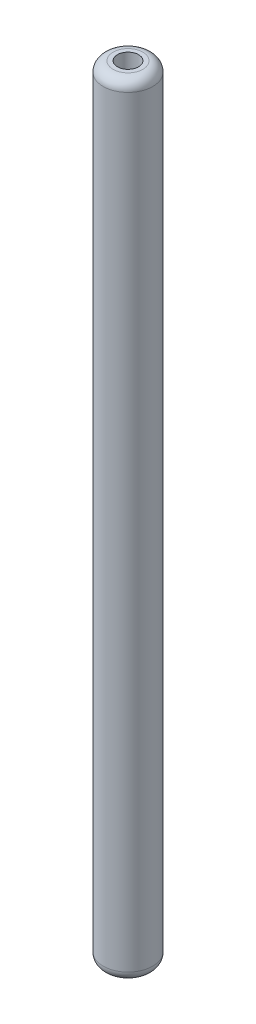
ISO-10303-21;
HEADER;
FILE_DESCRIPTION(('STEP AP214'),'2;1');
FILE_NAME('part.step','',(''),(''),'','','');
FILE_SCHEMA(('AUTOMOTIVE_DESIGN { 1 0 10303 214 1 1 1 1 }'));
ENDSEC;
DATA;
#1=APPLICATION_CONTEXT('core data for automotive mechanical design processes');
#2=APPLICATION_PROTOCOL_DEFINITION('international standard','automotive_design',2000,#1);
#3=PRODUCT_CONTEXT('',#1,'mechanical');
#4=PRODUCT('Part','Part','',(#3));
#5=PRODUCT_RELATED_PRODUCT_CATEGORY('part','',(#4));
#6=PRODUCT_DEFINITION_FORMATION('','',#4);
#7=PRODUCT_DEFINITION_CONTEXT('part definition',#1,'design');
#8=PRODUCT_DEFINITION('design','',#6,#7);
#9=PRODUCT_DEFINITION_SHAPE('','',#8);
#10=(LENGTH_UNIT() NAMED_UNIT(*) SI_UNIT(.MILLI.,.METRE.));
#11=(NAMED_UNIT(*) PLANE_ANGLE_UNIT() SI_UNIT($,.RADIAN.));
#12=(NAMED_UNIT(*) SI_UNIT($,.STERADIAN.) SOLID_ANGLE_UNIT());
#13=UNCERTAINTY_MEASURE_WITH_UNIT(LENGTH_MEASURE(1.E-05),#10,'distance_accuracy_value','');
#14=(GEOMETRIC_REPRESENTATION_CONTEXT(3) GLOBAL_UNCERTAINTY_ASSIGNED_CONTEXT((#13)) GLOBAL_UNIT_ASSIGNED_CONTEXT((#10,
#11,#12)) REPRESENTATION_CONTEXT('',''));
#15=CARTESIAN_POINT('',(0.,0.,0.));
#16=DIRECTION('',(0.,0.,1.));
#17=DIRECTION('',(1.,0.,0.));
#18=AXIS2_PLACEMENT_3D('',#15,#16,#17);
#19=CARTESIAN_POINT('',(0.,200.025,0.));
#20=DIRECTION('',(0.,-1.,0.));
#21=DIRECTION('',(0.,0.,-1.));
#22=AXIS2_PLACEMENT_3D('',#19,#20,#21);
#23=CYLINDRICAL_SURFACE('',#22,6.35);
#24=CARTESIAN_POINT('',(0.,2.53999999999996,0.));
#25=DIRECTION('',(0.,1.,0.));
#26=DIRECTION('',(0.,0.,1.));
#27=AXIS2_PLACEMENT_3D('',#24,#25,#26);
#28=CIRCLE('',#27,6.35);
#29=CARTESIAN_POINT('',(0.,2.53999999999993,-6.35));
#30=VERTEX_POINT('',#29);
#31=EDGE_CURVE('E46',#30,#30,#28,.T.);
#32=CARTESIAN_POINT('',(0.,197.485,0.));
#33=DIRECTION('',(0.,1.,0.));
#34=DIRECTION('',(0.,0.,1.));
#35=AXIS2_PLACEMENT_3D('',#32,#33,#34);
#36=CIRCLE('',#35,6.35);
#37=CARTESIAN_POINT('',(0.,197.485,-6.35));
#38=VERTEX_POINT('',#37);
#39=EDGE_CURVE('E76',#38,#38,#36,.F.);
#40=CARTESIAN_POINT('',(0.,2.53999999999993,-6.35));
#41=CARTESIAN_POINT('',(0.,4.57067708333326,-6.35));
#42=CARTESIAN_POINT('',(0.,6.60135416666659,-6.35));
#43=CARTESIAN_POINT('',(0.,10.6627083333333,-6.35));
#44=CARTESIAN_POINT('',(0.,12.6933854166666,-6.35));
#45=CARTESIAN_POINT('',(0.,16.7547395833333,-6.35));
#46=CARTESIAN_POINT('',(0.,18.7854166666666,-6.35));
#47=CARTESIAN_POINT('',(0.,22.8467708333333,-6.35));
#48=CARTESIAN_POINT('',(0.,24.8774479166666,-6.35));
#49=CARTESIAN_POINT('',(0.,28.9388020833333,-6.35));
#50=CARTESIAN_POINT('',(0.,30.9694791666666,-6.35));
#51=CARTESIAN_POINT('',(0.,35.0308333333333,-6.35));
#52=CARTESIAN_POINT('',(0.,37.0615104166666,-6.35));
#53=CARTESIAN_POINT('',(0.,41.1228645833333,-6.35));
#54=CARTESIAN_POINT('',(0.,43.1535416666666,-6.35));
#55=CARTESIAN_POINT('',(0.,47.2148958333333,-6.35));
#56=CARTESIAN_POINT('',(0.,49.2455729166666,-6.35));
#57=CARTESIAN_POINT('',(0.,53.3069270833333,-6.35));
#58=CARTESIAN_POINT('',(0.,55.3376041666666,-6.35));
#59=CARTESIAN_POINT('',(0.,59.3989583333333,-6.35));
#60=CARTESIAN_POINT('',(0.,61.4296354166666,-6.35));
#61=CARTESIAN_POINT('',(0.,65.4909895833333,-6.35));
#62=CARTESIAN_POINT('',(0.,67.5216666666666,-6.35));
#63=CARTESIAN_POINT('',(0.,71.5830208333333,-6.35));
#64=CARTESIAN_POINT('',(0.,73.6136979166666,-6.35));
#65=CARTESIAN_POINT('',(0.,77.6750520833333,-6.35));
#66=CARTESIAN_POINT('',(0.,79.7057291666666,-6.35));
#67=CARTESIAN_POINT('',(0.,83.7670833333333,-6.35));
#68=CARTESIAN_POINT('',(0.,85.7977604166666,-6.35));
#69=CARTESIAN_POINT('',(0.,89.8591145833333,-6.35));
#70=CARTESIAN_POINT('',(0.,91.8897916666666,-6.35));
#71=CARTESIAN_POINT('',(0.,95.9511458333333,-6.35));
#72=CARTESIAN_POINT('',(0.,97.9818229166666,-6.35));
#73=CARTESIAN_POINT('',(0.,102.043177083333,-6.35));
#74=CARTESIAN_POINT('',(0.,104.073854166667,-6.35));
#75=CARTESIAN_POINT('',(0.,108.135208333333,-6.35));
#76=CARTESIAN_POINT('',(0.,110.165885416667,-6.35));
#77=CARTESIAN_POINT('',(0.,114.227239583333,-6.35));
#78=CARTESIAN_POINT('',(0.,116.257916666667,-6.35));
#79=CARTESIAN_POINT('',(0.,120.319270833333,-6.35));
#80=CARTESIAN_POINT('',(0.,122.349947916667,-6.35));
#81=CARTESIAN_POINT('',(0.,126.411302083333,-6.35));
#82=CARTESIAN_POINT('',(0.,128.441979166667,-6.35));
#83=CARTESIAN_POINT('',(0.,132.503333333333,-6.35));
#84=CARTESIAN_POINT('',(0.,134.534010416667,-6.35));
#85=CARTESIAN_POINT('',(0.,138.595364583333,-6.35));
#86=CARTESIAN_POINT('',(0.,140.626041666667,-6.35));
#87=CARTESIAN_POINT('',(0.,144.687395833333,-6.35));
#88=CARTESIAN_POINT('',(0.,146.718072916667,-6.35));
#89=CARTESIAN_POINT('',(0.,150.779427083333,-6.35));
#90=CARTESIAN_POINT('',(0.,152.810104166667,-6.35));
#91=CARTESIAN_POINT('',(0.,156.871458333333,-6.35));
#92=CARTESIAN_POINT('',(0.,158.902135416667,-6.35));
#93=CARTESIAN_POINT('',(0.,162.963489583333,-6.35));
#94=CARTESIAN_POINT('',(0.,164.994166666667,-6.35));
#95=CARTESIAN_POINT('',(0.,169.055520833333,-6.35));
#96=CARTESIAN_POINT('',(0.,171.086197916667,-6.35));
#97=CARTESIAN_POINT('',(0.,175.147552083333,-6.35));
#98=CARTESIAN_POINT('',(0.,177.178229166667,-6.35));
#99=CARTESIAN_POINT('',(0.,181.239583333333,-6.35));
#100=CARTESIAN_POINT('',(0.,183.270260416667,-6.35));
#101=CARTESIAN_POINT('',(0.,187.331614583333,-6.35));
#102=CARTESIAN_POINT('',(0.,189.362291666667,-6.35));
#103=CARTESIAN_POINT('',(0.,193.423645833333,-6.35));
#104=CARTESIAN_POINT('',(0.,195.454322916667,-6.35));
#105=CARTESIAN_POINT('',(0.,197.485,-6.35));
#106=B_SPLINE_CURVE_WITH_KNOTS('',3,(#40,#41,#42,#43,#44,#45,#46,#47,#48,#49,#50,#51,#52,#53,
#54,#55,#56,#57,#58,#59,#60,#61,#62,#63,#64,#65,#66,#67,#68,#69,#70,#71,#72,#73,#74,#75,#76,#77,
#78,#79,#80,#81,#82,#83,#84,#85,#86,#87,#88,#89,#90,#91,#92,#93,#94,#95,#96,#97,#98,#99,#100,
#101,#102,#103,#104,#105),.UNSPECIFIED.,.F.,.F.,(4,2,2,2,2,2,2,2,2,2,2,2,2,2,2,2,2,2,2,2,2,2,2,
2,2,2,2,2,2,2,2,2,4),(0.,6.09203124999999,12.1840625,18.27609375,24.368125,30.46015625,
36.5521875,42.64421875,48.73625,54.82828125,60.9203125,67.01234375,73.104375,79.19640625,
85.2884375,91.38046875,97.4725,103.56453125,109.6565625,115.74859375,121.840625,127.93265625,
134.0246875,140.11671875,146.20875,152.30078125,158.3928125,164.48484375,170.576875,
176.66890625,182.7609375,188.85296875,194.945),.UNSPECIFIED.);
#107=EDGE_CURVE('BSEAM38',#30,#38,#106,.T.);
#108=ORIENTED_EDGE('',*,*,#31,.T.);
#109=ORIENTED_EDGE('',*,*,#39,.T.);
#110=ORIENTED_EDGE('',*,*,#107,.T.);
#111=ORIENTED_EDGE('',*,*,#107,.F.);
#112=EDGE_LOOP('',(#108,#110,#109,#111));
#113=FACE_BOUND('',#112,.T.);
#114=ADVANCED_FACE('F38',(#113),#23,.T.);
#115=CARTESIAN_POINT('',(0.,200.025,0.));
#116=DIRECTION('',(0.,1.,0.));
#117=DIRECTION('',(0.,0.,1.));
#118=AXIS2_PLACEMENT_3D('',#115,#116,#117);
#119=PLANE('',#118);
#120=CARTESIAN_POINT('',(0.,200.025,0.));
#121=DIRECTION('',(0.,1.,0.));
#122=DIRECTION('',(0.,0.,1.));
#123=AXIS2_PLACEMENT_3D('',#120,#121,#122);
#124=CIRCLE('',#123,3.81);
#125=CARTESIAN_POINT('',(0.,200.025,3.81));
#126=VERTEX_POINT('',#125);
#127=EDGE_CURVE('E73',#126,#126,#124,.T.);
#128=ORIENTED_EDGE('',*,*,#127,.T.);
#129=EDGE_LOOP('',(#128));
#130=FACE_BOUND('',#129,.T.);
#131=CARTESIAN_POINT('',(0.,200.025,0.));
#132=DIRECTION('',(0.,1.,0.));
#133=DIRECTION('',(0.,0.,1.));
#134=AXIS2_PLACEMENT_3D('',#131,#132,#133);
#135=CIRCLE('',#134,2.7051);
#136=CARTESIAN_POINT('',(0.,200.025,2.7051));
#137=VERTEX_POINT('',#136);
#138=EDGE_CURVE('E62',#137,#137,#135,.T.);
#139=ORIENTED_EDGE('',*,*,#138,.F.);
#140=EDGE_LOOP('',(#139));
#141=FACE_BOUND('',#140,.T.);
#142=ADVANCED_FACE('F92',(#130,#141),#119,.T.);
#143=CARTESIAN_POINT('',(0.,0.,0.));
#144=DIRECTION('',(0.,1.,0.));
#145=DIRECTION('',(0.,0.,1.));
#146=AXIS2_PLACEMENT_3D('',#143,#144,#145);
#147=PLANE('',#146);
#148=CARTESIAN_POINT('',(0.,0.,0.));
#149=DIRECTION('',(0.,1.,0.));
#150=DIRECTION('',(0.,0.,1.));
#151=AXIS2_PLACEMENT_3D('',#148,#149,#150);
#152=CIRCLE('',#151,3.81);
#153=CARTESIAN_POINT('',(0.,0.,3.81));
#154=VERTEX_POINT('',#153);
#155=EDGE_CURVE('E11',#154,#154,#152,.F.);
#156=ORIENTED_EDGE('',*,*,#155,.T.);
#157=EDGE_LOOP('',(#156));
#158=FACE_BOUND('',#157,.T.);
#159=CARTESIAN_POINT('',(0.,0.,0.));
#160=DIRECTION('',(0.,-1.,0.));
#161=DIRECTION('',(0.,0.,-1.));
#162=AXIS2_PLACEMENT_3D('',#159,#160,#161);
#163=CIRCLE('',#162,2.70509999999999);
#164=CARTESIAN_POINT('',(0.,0.,-2.70509999999999));
#165=VERTEX_POINT('',#164);
#166=EDGE_CURVE('E63',#165,#165,#163,.T.);
#167=ORIENTED_EDGE('',*,*,#166,.F.);
#168=EDGE_LOOP('',(#167));
#169=FACE_BOUND('',#168,.T.);
#170=ADVANCED_FACE('F97',(#158,#169),#147,.F.);
#171=CARTESIAN_POINT('',(0.,170.053,0.));
#172=DIRECTION('',(0.,1.,0.));
#173=DIRECTION('',(0.,0.,1.));
#174=AXIS2_PLACEMENT_3D('',#171,#172,#173);
#175=CONICAL_SURFACE('',#174,2.70509999999999,1.02974425867665);
#176=CARTESIAN_POINT('',(0.,168.427611939469,0.));
#177=VERTEX_POINT('',#176);
#178=VERTEX_LOOP('',#177);
#179=FACE_BOUND('',#178,.T.);
#180=CARTESIAN_POINT('',(0.,170.053,0.));
#181=DIRECTION('',(0.,1.,0.));
#182=DIRECTION('',(0.,0.,1.));
#183=AXIS2_PLACEMENT_3D('',#180,#181,#182);
#184=CIRCLE('',#183,2.70509999999999);
#185=CARTESIAN_POINT('',(0.,170.053,2.70509999999999));
#186=VERTEX_POINT('',#185);
#187=EDGE_CURVE('E66',#186,#186,#184,.T.);
#188=ORIENTED_EDGE('',*,*,#187,.T.);
#189=EDGE_LOOP('',(#188));
#190=FACE_BOUND('',#189,.T.);
#191=ADVANCED_FACE('F102',(#179,#190),#175,.F.);
#192=CARTESIAN_POINT('',(0.,200.025,0.));
#193=DIRECTION('',(0.,1.,0.));
#194=DIRECTION('',(0.,0.,1.));
#195=AXIS2_PLACEMENT_3D('',#192,#193,#194);
#196=CYLINDRICAL_SURFACE('',#195,2.70509999999999);
#197=ORIENTED_EDGE('',*,*,#187,.F.);
#198=EDGE_LOOP('',(#197));
#199=FACE_BOUND('',#198,.T.);
#200=ORIENTED_EDGE('',*,*,#138,.T.);
#201=EDGE_LOOP('',(#200));
#202=FACE_BOUND('',#201,.T.);
#203=ADVANCED_FACE('F56',(#199,#202),#196,.F.);
#204=CARTESIAN_POINT('',(0.,29.972,0.));
#205=DIRECTION('',(0.,-1.,0.));
#206=DIRECTION('',(0.,0.,-1.));
#207=AXIS2_PLACEMENT_3D('',#204,#205,#206);
#208=CONICAL_SURFACE('',#207,2.70509999999999,1.02974425867665);
#209=CARTESIAN_POINT('',(0.,31.5973880605314,0.));
#210=VERTEX_POINT('',#209);
#211=VERTEX_LOOP('',#210);
#212=FACE_BOUND('',#211,.T.);
#213=CARTESIAN_POINT('',(0.,29.972,0.));
#214=DIRECTION('',(0.,-1.,0.));
#215=DIRECTION('',(0.,0.,-1.));
#216=AXIS2_PLACEMENT_3D('',#213,#214,#215);
#217=CIRCLE('',#216,2.70509999999999);
#218=CARTESIAN_POINT('',(0.,29.972,-2.70509999999999));
#219=VERTEX_POINT('',#218);
#220=EDGE_CURVE('E60',#219,#219,#217,.T.);
#221=ORIENTED_EDGE('',*,*,#220,.T.);
#222=EDGE_LOOP('',(#221));
#223=FACE_BOUND('',#222,.T.);
#224=ADVANCED_FACE('F52',(#212,#223),#208,.F.);
#225=CARTESIAN_POINT('',(0.,0.,0.));
#226=DIRECTION('',(0.,-1.,0.));
#227=DIRECTION('',(0.,0.,-1.));
#228=AXIS2_PLACEMENT_3D('',#225,#226,#227);
#229=CYLINDRICAL_SURFACE('',#228,2.70509999999999);
#230=ORIENTED_EDGE('',*,*,#220,.F.);
#231=EDGE_LOOP('',(#230));
#232=FACE_BOUND('',#231,.T.);
#233=ORIENTED_EDGE('',*,*,#166,.T.);
#234=EDGE_LOOP('',(#233));
#235=FACE_BOUND('',#234,.T.);
#236=ADVANCED_FACE('F55',(#232,#235),#229,.F.);
#237=CARTESIAN_POINT('',(0.,197.485,0.));
#238=DIRECTION('',(0.,1.,0.));
#239=DIRECTION('',(0.,0.,1.));
#240=AXIS2_PLACEMENT_3D('',#237,#238,#239);
#241=TOROIDAL_SURFACE('',#240,3.81,2.54);
#242=ORIENTED_EDGE('',*,*,#39,.F.);
#243=EDGE_LOOP('',(#242));
#244=FACE_BOUND('',#243,.T.);
#245=ORIENTED_EDGE('',*,*,#127,.F.);
#246=EDGE_LOOP('',(#245));
#247=FACE_BOUND('',#246,.T.);
#248=ADVANCED_FACE('F84',(#244,#247),#241,.T.);
#249=CARTESIAN_POINT('',(0.,2.53999999999999,0.));
#250=DIRECTION('',(0.,1.,0.));
#251=DIRECTION('',(0.,0.,1.));
#252=AXIS2_PLACEMENT_3D('',#249,#250,#251);
#253=TOROIDAL_SURFACE('',#252,3.81,2.54);
#254=ORIENTED_EDGE('',*,*,#155,.F.);
#255=EDGE_LOOP('',(#254));
#256=FACE_BOUND('',#255,.T.);
#257=ORIENTED_EDGE('',*,*,#31,.F.);
#258=EDGE_LOOP('',(#257));
#259=FACE_BOUND('',#258,.T.);
#260=ADVANCED_FACE('F40',(#256,#259),#253,.T.);
#261=CLOSED_SHELL('',(#114,#142,#170,#191,#203,#224,#236,#248,#260));
#262=MANIFOLD_SOLID_BREP('B2',#261);
#263=ADVANCED_BREP_SHAPE_REPRESENTATION('',(#18,#262),#14);
#264=SHAPE_DEFINITION_REPRESENTATION(#9,#263);
ENDSEC;
END-ISO-10303-21;
